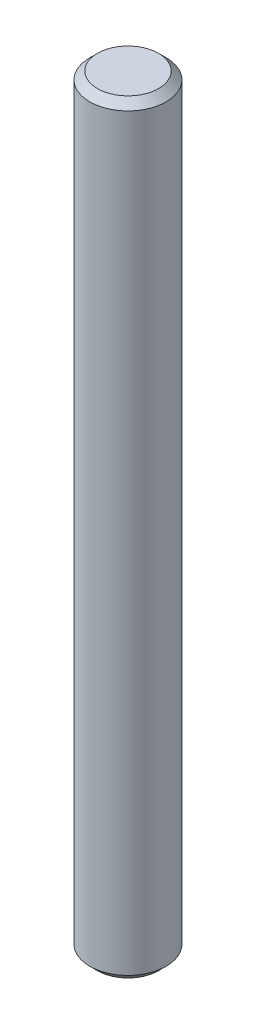
ISO-10303-21;
HEADER;
FILE_DESCRIPTION(('STEP AP214'),'2;1');
FILE_NAME('part.step','',(''),(''),'','','');
FILE_SCHEMA(('AUTOMOTIVE_DESIGN { 1 0 10303 214 1 1 1 1 }'));
ENDSEC;
DATA;
#1=APPLICATION_CONTEXT('core data for automotive mechanical design processes');
#2=APPLICATION_PROTOCOL_DEFINITION('international standard','automotive_design',2000,#1);
#3=PRODUCT_CONTEXT('',#1,'mechanical');
#4=PRODUCT('Part','Part','',(#3));
#5=PRODUCT_RELATED_PRODUCT_CATEGORY('part','',(#4));
#6=PRODUCT_DEFINITION_FORMATION('','',#4);
#7=PRODUCT_DEFINITION_CONTEXT('part definition',#1,'design');
#8=PRODUCT_DEFINITION('design','',#6,#7);
#9=PRODUCT_DEFINITION_SHAPE('','',#8);
#10=(LENGTH_UNIT() NAMED_UNIT(*) SI_UNIT(.MILLI.,.METRE.));
#11=(NAMED_UNIT(*) PLANE_ANGLE_UNIT() SI_UNIT($,.RADIAN.));
#12=(NAMED_UNIT(*) SI_UNIT($,.STERADIAN.) SOLID_ANGLE_UNIT());
#13=UNCERTAINTY_MEASURE_WITH_UNIT(LENGTH_MEASURE(1.E-05),#10,'distance_accuracy_value','');
#14=(GEOMETRIC_REPRESENTATION_CONTEXT(3) GLOBAL_UNCERTAINTY_ASSIGNED_CONTEXT((#13)) GLOBAL_UNIT_ASSIGNED_CONTEXT((#10,
#11,#12)) REPRESENTATION_CONTEXT('',''));
#15=CARTESIAN_POINT('',(0.,0.,0.));
#16=DIRECTION('',(0.,0.,1.));
#17=DIRECTION('',(1.,0.,0.));
#18=AXIS2_PLACEMENT_3D('',#15,#16,#17);
#19=CARTESIAN_POINT('',(0.,20.,0.));
#20=DIRECTION('',(0.,-1.,0.));
#21=DIRECTION('',(0.,0.,-1.));
#22=AXIS2_PLACEMENT_3D('',#19,#20,#21);
#23=CYLINDRICAL_SURFACE('',#22,1.);
#24=CARTESIAN_POINT('',(0.,0.200000000000002,0.));
#25=DIRECTION('',(0.,1.,0.));
#26=DIRECTION('',(0.,0.,1.));
#27=AXIS2_PLACEMENT_3D('',#24,#25,#26);
#28=CIRCLE('',#27,1.);
#29=CARTESIAN_POINT('',(0.,0.200000000000002,1.));
#30=VERTEX_POINT('',#29);
#31=EDGE_CURVE('E51',#30,#30,#28,.T.);
#32=ORIENTED_EDGE('',*,*,#31,.T.);
#33=EDGE_LOOP('',(#32));
#34=FACE_BOUND('',#33,.T.);
#35=CARTESIAN_POINT('',(0.,19.8,0.));
#36=DIRECTION('',(0.,1.,0.));
#37=DIRECTION('',(0.,0.,1.));
#38=AXIS2_PLACEMENT_3D('',#35,#36,#37);
#39=CIRCLE('',#38,1.);
#40=CARTESIAN_POINT('',(0.,19.8,1.));
#41=VERTEX_POINT('',#40);
#42=EDGE_CURVE('E55',#41,#41,#39,.F.);
#43=ORIENTED_EDGE('',*,*,#42,.T.);
#44=EDGE_LOOP('',(#43));
#45=FACE_BOUND('',#44,.T.);
#46=ADVANCED_FACE('F39',(#34,#45),#23,.T.);
#47=CARTESIAN_POINT('',(0.,20.,0.));
#48=DIRECTION('',(0.,1.,0.));
#49=DIRECTION('',(0.,0.,1.));
#50=AXIS2_PLACEMENT_3D('',#47,#48,#49);
#51=PLANE('',#50);
#52=CARTESIAN_POINT('',(0.,20.,0.));
#53=DIRECTION('',(0.,1.,0.));
#54=DIRECTION('',(0.,0.,1.));
#55=AXIS2_PLACEMENT_3D('',#52,#53,#54);
#56=CIRCLE('',#55,0.800000000000002);
#57=CARTESIAN_POINT('',(0.,20.,0.800000000000002));
#58=VERTEX_POINT('',#57);
#59=EDGE_CURVE('E10',#58,#58,#56,.T.);
#60=ORIENTED_EDGE('',*,*,#59,.T.);
#61=EDGE_LOOP('',(#60));
#62=FACE_BOUND('',#61,.T.);
#63=ADVANCED_FACE('F71',(#62),#51,.T.);
#64=CARTESIAN_POINT('',(0.,0.,0.));
#65=DIRECTION('',(0.,1.,0.));
#66=DIRECTION('',(0.,0.,1.));
#67=AXIS2_PLACEMENT_3D('',#64,#65,#66);
#68=PLANE('',#67);
#69=CARTESIAN_POINT('',(0.,0.,0.));
#70=DIRECTION('',(0.,1.,0.));
#71=DIRECTION('',(0.,0.,1.));
#72=AXIS2_PLACEMENT_3D('',#69,#70,#71);
#73=CIRCLE('',#72,0.799999999999997);
#74=CARTESIAN_POINT('',(0.,0.,0.799999999999997));
#75=VERTEX_POINT('',#74);
#76=EDGE_CURVE('E47',#75,#75,#73,.F.);
#77=ORIENTED_EDGE('',*,*,#76,.T.);
#78=EDGE_LOOP('',(#77));
#79=FACE_BOUND('',#78,.T.);
#80=ADVANCED_FACE('F68',(#79),#68,.F.);
#81=CARTESIAN_POINT('',(0.,0.200000000000002,0.));
#82=DIRECTION('',(0.,1.,0.));
#83=DIRECTION('',(0.,0.,1.));
#84=AXIS2_PLACEMENT_3D('',#81,#82,#83);
#85=CONICAL_SURFACE('',#84,1.,0.78539816339745);
#86=ORIENTED_EDGE('',*,*,#76,.F.);
#87=EDGE_LOOP('',(#86));
#88=FACE_BOUND('',#87,.T.);
#89=ORIENTED_EDGE('',*,*,#31,.F.);
#90=EDGE_LOOP('',(#89));
#91=FACE_BOUND('',#90,.T.);
#92=ADVANCED_FACE('F64',(#88,#91),#85,.T.);
#93=CARTESIAN_POINT('',(0.,20.,0.));
#94=DIRECTION('',(0.,-1.,0.));
#95=DIRECTION('',(0.,0.,-1.));
#96=AXIS2_PLACEMENT_3D('',#93,#94,#95);
#97=CONICAL_SURFACE('',#96,0.800000000000002,0.785398163397455);
#98=ORIENTED_EDGE('',*,*,#42,.F.);
#99=EDGE_LOOP('',(#98));
#100=FACE_BOUND('',#99,.T.);
#101=ORIENTED_EDGE('',*,*,#59,.F.);
#102=EDGE_LOOP('',(#101));
#103=FACE_BOUND('',#102,.T.);
#104=ADVANCED_FACE('F42',(#100,#103),#97,.T.);
#105=CLOSED_SHELL('',(#46,#63,#80,#92,#104));
#106=MANIFOLD_SOLID_BREP('B2',#105);
#107=ADVANCED_BREP_SHAPE_REPRESENTATION('',(#18,#106),#14);
#108=SHAPE_DEFINITION_REPRESENTATION(#9,#107);
ENDSEC;
END-ISO-10303-21;
